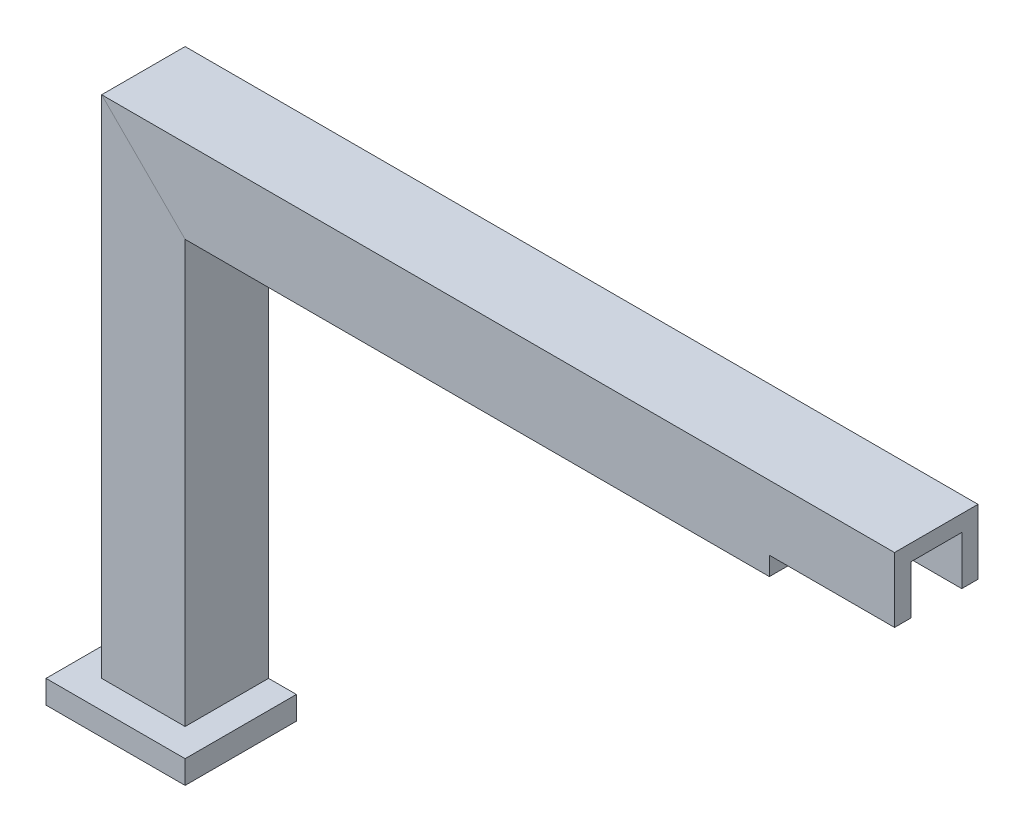
ISO-10303-21;
HEADER;
FILE_DESCRIPTION(('STEP AP214'),'2;1');
FILE_NAME('part.step','',(''),(''),'','','');
FILE_SCHEMA(('AUTOMOTIVE_DESIGN { 1 0 10303 214 1 1 1 1 }'));
ENDSEC;
DATA;
#1=APPLICATION_CONTEXT('core data for automotive mechanical design processes');
#2=APPLICATION_PROTOCOL_DEFINITION('international standard','automotive_design',2000,#1);
#3=PRODUCT_CONTEXT('',#1,'mechanical');
#4=PRODUCT('Part','Part','',(#3));
#5=PRODUCT_RELATED_PRODUCT_CATEGORY('part','',(#4));
#6=PRODUCT_DEFINITION_FORMATION('','',#4);
#7=PRODUCT_DEFINITION_CONTEXT('part definition',#1,'design');
#8=PRODUCT_DEFINITION('design','',#6,#7);
#9=PRODUCT_DEFINITION_SHAPE('','',#8);
#10=(LENGTH_UNIT() NAMED_UNIT(*) SI_UNIT(.MILLI.,.METRE.));
#11=(NAMED_UNIT(*) PLANE_ANGLE_UNIT() SI_UNIT($,.RADIAN.));
#12=(NAMED_UNIT(*) SI_UNIT($,.STERADIAN.) SOLID_ANGLE_UNIT());
#13=UNCERTAINTY_MEASURE_WITH_UNIT(LENGTH_MEASURE(1.E-05),#10,'distance_accuracy_value','');
#14=(GEOMETRIC_REPRESENTATION_CONTEXT(3) GLOBAL_UNCERTAINTY_ASSIGNED_CONTEXT((#13)) GLOBAL_UNIT_ASSIGNED_CONTEXT((#10,
#11,#12)) REPRESENTATION_CONTEXT('',''));
#15=CARTESIAN_POINT('',(0.,0.,0.));
#16=DIRECTION('',(0.,0.,1.));
#17=DIRECTION('',(1.,0.,0.));
#18=AXIS2_PLACEMENT_3D('',#15,#16,#17);
#19=CARTESIAN_POINT('',(-6.14999999999999,94.5,5.5));
#20=DIRECTION('',(0.,1.,0.));
#21=DIRECTION('',(0.,0.,1.));
#22=AXIS2_PLACEMENT_3D('',#19,#20,#21);
#23=PLANE('',#22);
#24=DIRECTION('',(0.,0.,1.));
#25=VECTOR('',#24,1.);
#26=CARTESIAN_POINT('',(135.,94.5,5.49999999999978));
#27=LINE('',#26,#25);
#28=CARTESIAN_POINT('',(135.,94.5,-5.5));
#29=VERTEX_POINT('',#28);
#30=CARTESIAN_POINT('',(135.,94.5,5.5));
#31=VERTEX_POINT('',#30);
#32=EDGE_CURVE('E422',#29,#31,#27,.T.);
#33=ORIENTED_EDGE('',*,*,#32,.F.);
#34=DIRECTION('',(1.,0.,0.));
#35=VECTOR('',#34,1.);
#36=CARTESIAN_POINT('',(-6.14999999999999,94.5,-5.5));
#37=LINE('',#36,#35);
#38=CARTESIAN_POINT('',(5.50000000000001,94.5,-5.5));
#39=VERTEX_POINT('',#38);
#40=EDGE_CURVE('E282',#39,#29,#37,.T.);
#41=ORIENTED_EDGE('',*,*,#40,.F.);
#42=DIRECTION('',(0.,0.,-1.));
#43=VECTOR('',#42,1.);
#44=CARTESIAN_POINT('',(5.5,94.5,5.5));
#45=LINE('',#44,#43);
#46=CARTESIAN_POINT('',(5.50000000000001,94.5,5.5));
#47=VERTEX_POINT('',#46);
#48=EDGE_CURVE('E224',#47,#39,#45,.T.);
#49=ORIENTED_EDGE('',*,*,#48,.F.);
#50=DIRECTION('',(1.,0.,0.));
#51=VECTOR('',#50,1.);
#52=CARTESIAN_POINT('',(-6.14999999999999,94.5,5.5));
#53=LINE('',#52,#51);
#54=EDGE_CURVE('E277',#47,#31,#53,.T.);
#55=ORIENTED_EDGE('',*,*,#54,.T.);
#56=EDGE_LOOP('',(#33,#41,#49,#55));
#57=FACE_BOUND('',#56,.T.);
#58=ADVANCED_FACE('F38',(#57),#23,.T.);
#59=CARTESIAN_POINT('',(0.,0.,0.));
#60=DIRECTION('',(0.,1.,0.));
#61=DIRECTION('',(0.,0.,1.));
#62=AXIS2_PLACEMENT_3D('',#59,#60,#61);
#63=PLANE('',#62);
#64=DIRECTION('',(0.,0.,1.));
#65=VECTOR('',#64,1.);
#66=CARTESIAN_POINT('',(-5.5,0.,5.5));
#67=LINE('',#66,#65);
#68=CARTESIAN_POINT('',(-5.5,0.,5.5));
#69=VERTEX_POINT('',#68);
#70=CARTESIAN_POINT('',(-5.5,0.,-5.5));
#71=VERTEX_POINT('',#70);
#72=EDGE_CURVE('E252',#69,#71,#67,.F.);
#73=ORIENTED_EDGE('',*,*,#72,.F.);
#74=DIRECTION('',(1.,0.,0.));
#75=VECTOR('',#74,1.);
#76=CARTESIAN_POINT('',(5.5,0.,5.5));
#77=LINE('',#76,#75);
#78=CARTESIAN_POINT('',(5.5,0.,5.5));
#79=VERTEX_POINT('',#78);
#80=EDGE_CURVE('E256',#79,#69,#77,.F.);
#81=ORIENTED_EDGE('',*,*,#80,.F.);
#82=DIRECTION('',(0.,0.,-1.));
#83=VECTOR('',#82,1.);
#84=CARTESIAN_POINT('',(5.5,0.,5.5));
#85=LINE('',#84,#83);
#86=CARTESIAN_POINT('',(5.5,0.,-5.5));
#87=VERTEX_POINT('',#86);
#88=EDGE_CURVE('E241',#87,#79,#85,.F.);
#89=ORIENTED_EDGE('',*,*,#88,.F.);
#90=DIRECTION('',(-1.,0.,0.));
#91=VECTOR('',#90,1.);
#92=CARTESIAN_POINT('',(5.5,0.,-5.5));
#93=LINE('',#92,#91);
#94=EDGE_CURVE('E237',#71,#87,#93,.F.);
#95=ORIENTED_EDGE('',*,*,#94,.F.);
#96=EDGE_LOOP('',(#73,#81,#89,#95));
#97=FACE_BOUND('',#96,.T.);
#98=ADVANCED_FACE('F454',(#97),#63,.T.);
#99=CARTESIAN_POINT('',(-5.5,0.,5.5));
#100=DIRECTION('',(1.,0.,0.));
#101=DIRECTION('',(0.,0.,-1.));
#102=AXIS2_PLACEMENT_3D('',#99,#100,#101);
#103=PLANE('',#102);
#104=DIRECTION('',(0.,1.,0.));
#105=VECTOR('',#104,1.);
#106=CARTESIAN_POINT('',(-5.5,0.,-5.5));
#107=LINE('',#106,#105);
#108=CARTESIAN_POINT('',(-5.49999999999999,105.5,-5.5));
#109=VERTEX_POINT('',#108);
#110=EDGE_CURVE('E248',#71,#109,#107,.T.);
#111=ORIENTED_EDGE('',*,*,#110,.T.);
#112=DIRECTION('',(0.,0.,1.));
#113=VECTOR('',#112,1.);
#114=CARTESIAN_POINT('',(-5.5,105.5,5.5));
#115=LINE('',#114,#113);
#116=CARTESIAN_POINT('',(-5.49999999999999,105.5,5.5));
#117=VERTEX_POINT('',#116);
#118=EDGE_CURVE('E232',#109,#117,#115,.T.);
#119=ORIENTED_EDGE('',*,*,#118,.T.);
#120=DIRECTION('',(0.,1.,0.));
#121=VECTOR('',#120,1.);
#122=CARTESIAN_POINT('',(-5.5,0.,5.5));
#123=LINE('',#122,#121);
#124=EDGE_CURVE('E260',#69,#117,#123,.T.);
#125=ORIENTED_EDGE('',*,*,#124,.F.);
#126=ORIENTED_EDGE('',*,*,#72,.T.);
#127=EDGE_LOOP('',(#111,#119,#125,#126));
#128=FACE_BOUND('',#127,.T.);
#129=ADVANCED_FACE('F465',(#128),#103,.T.);
#130=CARTESIAN_POINT('',(5.5,0.,-5.5));
#131=DIRECTION('',(0.,0.,1.));
#132=DIRECTION('',(1.,0.,0.));
#133=AXIS2_PLACEMENT_3D('',#130,#131,#132);
#134=PLANE('',#133);
#135=DIRECTION('',(0.,1.,0.));
#136=VECTOR('',#135,1.);
#137=CARTESIAN_POINT('',(5.5,0.,-5.5));
#138=LINE('',#137,#136);
#139=EDGE_CURVE('E243',#87,#39,#138,.T.);
#140=ORIENTED_EDGE('',*,*,#139,.T.);
#141=DIRECTION('',(-0.707106781186548,0.707106781186548,0.));
#142=VECTOR('',#141,1.);
#143=CARTESIAN_POINT('',(52.75,47.25,-5.5));
#144=LINE('',#143,#142);
#145=EDGE_CURVE('E236',#39,#109,#144,.T.);
#146=ORIENTED_EDGE('',*,*,#145,.T.);
#147=ORIENTED_EDGE('',*,*,#110,.F.);
#148=ORIENTED_EDGE('',*,*,#94,.T.);
#149=EDGE_LOOP('',(#140,#146,#147,#148));
#150=FACE_BOUND('',#149,.T.);
#151=ADVANCED_FACE('F651',(#150),#134,.T.);
#152=CARTESIAN_POINT('',(5.5,0.,5.5));
#153=DIRECTION('',(-1.,0.,0.));
#154=DIRECTION('',(0.,0.,1.));
#155=AXIS2_PLACEMENT_3D('',#152,#153,#154);
#156=PLANE('',#155);
#157=DIRECTION('',(0.,1.,0.));
#158=VECTOR('',#157,1.);
#159=CARTESIAN_POINT('',(5.5,0.,5.5));
#160=LINE('',#159,#158);
#161=EDGE_CURVE('E247',#79,#47,#160,.T.);
#162=ORIENTED_EDGE('',*,*,#161,.T.);
#163=ORIENTED_EDGE('',*,*,#48,.T.);
#164=ORIENTED_EDGE('',*,*,#139,.F.);
#165=ORIENTED_EDGE('',*,*,#88,.T.);
#166=EDGE_LOOP('',(#162,#163,#164,#165));
#167=FACE_BOUND('',#166,.T.);
#168=ADVANCED_FACE('F643',(#167),#156,.T.);
#169=CARTESIAN_POINT('',(5.5,0.,5.5));
#170=DIRECTION('',(0.,0.,-1.));
#171=DIRECTION('',(-1.,0.,0.));
#172=AXIS2_PLACEMENT_3D('',#169,#170,#171);
#173=PLANE('',#172);
#174=ORIENTED_EDGE('',*,*,#124,.T.);
#175=DIRECTION('',(0.707106781186548,-0.707106781186548,0.));
#176=VECTOR('',#175,1.);
#177=CARTESIAN_POINT('',(52.75,47.25,5.5));
#178=LINE('',#177,#176);
#179=EDGE_CURVE('E228',#117,#47,#178,.T.);
#180=ORIENTED_EDGE('',*,*,#179,.T.);
#181=ORIENTED_EDGE('',*,*,#161,.F.);
#182=ORIENTED_EDGE('',*,*,#80,.T.);
#183=EDGE_LOOP('',(#174,#180,#181,#182));
#184=FACE_BOUND('',#183,.T.);
#185=ADVANCED_FACE('F479',(#184),#173,.T.);
#186=CARTESIAN_POINT('',(-6.14999999999999,105.5,5.5));
#187=DIRECTION('',(0.,-1.,0.));
#188=DIRECTION('',(0.,0.,-1.));
#189=AXIS2_PLACEMENT_3D('',#186,#187,#188);
#190=PLANE('',#189);
#191=DIRECTION('',(0.,0.,-1.));
#192=VECTOR('',#191,1.);
#193=CARTESIAN_POINT('',(161.990817936662,105.5,5.5));
#194=LINE('',#193,#192);
#195=CARTESIAN_POINT('',(161.990817936662,105.5,5.5));
#196=VERTEX_POINT('',#195);
#197=CARTESIAN_POINT('',(161.990817936662,105.5,-5.5));
#198=VERTEX_POINT('',#197);
#199=EDGE_CURVE('E397',#196,#198,#194,.T.);
#200=ORIENTED_EDGE('',*,*,#199,.F.);
#201=DIRECTION('',(1.,0.,0.));
#202=VECTOR('',#201,1.);
#203=CARTESIAN_POINT('',(-6.14999999999999,105.5,5.5));
#204=LINE('',#203,#202);
#205=EDGE_CURVE('E273',#117,#196,#204,.T.);
#206=ORIENTED_EDGE('',*,*,#205,.F.);
#207=ORIENTED_EDGE('',*,*,#118,.F.);
#208=DIRECTION('',(1.,0.,0.));
#209=VECTOR('',#208,1.);
#210=CARTESIAN_POINT('',(-6.14999999999999,105.5,-5.5));
#211=LINE('',#210,#209);
#212=EDGE_CURVE('E242',#109,#198,#211,.T.);
#213=ORIENTED_EDGE('',*,*,#212,.T.);
#214=EDGE_LOOP('',(#200,#206,#207,#213));
#215=FACE_BOUND('',#214,.T.);
#216=ADVANCED_FACE('F476',(#215),#190,.T.);
#217=CARTESIAN_POINT('',(-6.14999999999999,94.5,-5.5));
#218=DIRECTION('',(0.,0.,1.));
#219=DIRECTION('',(0.,-1.,0.));
#220=AXIS2_PLACEMENT_3D('',#217,#218,#219);
#221=PLANE('',#220);
#222=DIRECTION('',(0.,-1.,0.));
#223=VECTOR('',#222,1.);
#224=CARTESIAN_POINT('',(161.990817936662,94.5,-5.5));
#225=LINE('',#224,#223);
#226=CARTESIAN_POINT('',(161.990817936662,95.,-5.5));
#227=VERTEX_POINT('',#226);
#228=EDGE_CURVE('E394',#198,#227,#225,.T.);
#229=ORIENTED_EDGE('',*,*,#228,.F.);
#230=ORIENTED_EDGE('',*,*,#212,.F.);
#231=ORIENTED_EDGE('',*,*,#145,.F.);
#232=ORIENTED_EDGE('',*,*,#40,.T.);
#233=DIRECTION('',(0.,-1.,0.));
#234=VECTOR('',#233,1.);
#235=CARTESIAN_POINT('',(135.,94.5,-5.5));
#236=LINE('',#235,#234);
#237=CARTESIAN_POINT('',(135.,95.,-5.5));
#238=VERTEX_POINT('',#237);
#239=EDGE_CURVE('E213',#238,#29,#236,.T.);
#240=ORIENTED_EDGE('',*,*,#239,.F.);
#241=DIRECTION('',(1.,0.,0.));
#242=VECTOR('',#241,1.);
#243=CARTESIAN_POINT('',(-6.14999999999999,95.,-5.5));
#244=LINE('',#243,#242);
#245=EDGE_CURVE('E416',#238,#227,#244,.T.);
#246=ORIENTED_EDGE('',*,*,#245,.T.);
#247=EDGE_LOOP('',(#229,#230,#231,#232,#240,#246));
#248=FACE_BOUND('',#247,.T.);
#249=ADVANCED_FACE('F470',(#248),#221,.T.);
#250=CARTESIAN_POINT('',(-6.14999999999999,94.5,5.5));
#251=DIRECTION('',(0.,0.,-1.));
#252=DIRECTION('',(0.,1.,0.));
#253=AXIS2_PLACEMENT_3D('',#250,#251,#252);
#254=PLANE('',#253);
#255=DIRECTION('',(0.,1.,0.));
#256=VECTOR('',#255,1.);
#257=CARTESIAN_POINT('',(161.990817936662,94.5,5.5));
#258=LINE('',#257,#256);
#259=CARTESIAN_POINT('',(161.990817936662,95.,5.5));
#260=VERTEX_POINT('',#259);
#261=EDGE_CURVE('E391',#260,#196,#258,.T.);
#262=ORIENTED_EDGE('',*,*,#261,.F.);
#263=DIRECTION('',(-1.,0.,0.));
#264=VECTOR('',#263,1.);
#265=CARTESIAN_POINT('',(-6.14999999999999,95.,5.5));
#266=LINE('',#265,#264);
#267=CARTESIAN_POINT('',(135.,95.,5.5));
#268=VERTEX_POINT('',#267);
#269=EDGE_CURVE('E62',#260,#268,#266,.T.);
#270=ORIENTED_EDGE('',*,*,#269,.T.);
#271=DIRECTION('',(0.,1.,0.));
#272=VECTOR('',#271,1.);
#273=CARTESIAN_POINT('',(135.,94.5,5.5));
#274=LINE('',#273,#272);
#275=EDGE_CURVE('E346',#31,#268,#274,.T.);
#276=ORIENTED_EDGE('',*,*,#275,.F.);
#277=ORIENTED_EDGE('',*,*,#54,.F.);
#278=ORIENTED_EDGE('',*,*,#179,.F.);
#279=ORIENTED_EDGE('',*,*,#205,.T.);
#280=EDGE_LOOP('',(#262,#270,#276,#277,#278,#279));
#281=FACE_BOUND('',#280,.T.);
#282=ADVANCED_FACE('F472',(#281),#254,.T.);
#283=CARTESIAN_POINT('',(0.,95.,0.));
#284=DIRECTION('',(0.,-1.,0.));
#285=DIRECTION('',(0.,0.,-1.));
#286=AXIS2_PLACEMENT_3D('',#283,#284,#285);
#287=PLANE('',#286);
#288=DIRECTION('',(0.,0.,-1.));
#289=VECTOR('',#288,1.);
#290=CARTESIAN_POINT('',(161.990817936662,95.,0.));
#291=LINE('',#290,#289);
#292=CARTESIAN_POINT('',(161.990817936662,95.,-9.00000000000001));
#293=VERTEX_POINT('',#292);
#294=EDGE_CURVE('E54',#227,#293,#291,.T.);
#295=ORIENTED_EDGE('',*,*,#294,.F.);
#296=ORIENTED_EDGE('',*,*,#245,.F.);
#297=DIRECTION('',(0.,0.,-1.));
#298=VECTOR('',#297,1.);
#299=CARTESIAN_POINT('',(135.,95.,-9.00000000000001));
#300=LINE('',#299,#298);
#301=CARTESIAN_POINT('',(135.,95.,-9.00000000000001));
#302=VERTEX_POINT('',#301);
#303=EDGE_CURVE('E405',#238,#302,#300,.T.);
#304=ORIENTED_EDGE('',*,*,#303,.T.);
#305=DIRECTION('',(1.,0.,0.));
#306=VECTOR('',#305,1.);
#307=CARTESIAN_POINT('',(185.,95.,-9.00000000000001));
#308=LINE('',#307,#306);
#309=EDGE_CURVE('E404',#302,#293,#308,.T.);
#310=ORIENTED_EDGE('',*,*,#309,.T.);
#311=EDGE_LOOP('',(#295,#296,#304,#310));
#312=FACE_BOUND('',#311,.T.);
#313=ADVANCED_FACE('F475',(#312),#287,.T.);
#314=CARTESIAN_POINT('',(135.,95.,-9.00000000000001));
#315=DIRECTION('',(-1.,0.,0.));
#316=DIRECTION('',(0.,0.,1.));
#317=AXIS2_PLACEMENT_3D('',#314,#315,#316);
#318=PLANE('',#317);
#319=ORIENTED_EDGE('',*,*,#239,.T.);
#320=ORIENTED_EDGE('',*,*,#32,.T.);
#321=ORIENTED_EDGE('',*,*,#275,.T.);
#322=CARTESIAN_POINT('',(135.,95.,9.));
#323=VERTEX_POINT('',#322);
#324=EDGE_CURVE('E401',#323,#268,#300,.T.);
#325=ORIENTED_EDGE('',*,*,#324,.F.);
#326=DIRECTION('',(0.,-1.,0.));
#327=VECTOR('',#326,1.);
#328=CARTESIAN_POINT('',(135.,95.,9.));
#329=LINE('',#328,#327);
#330=CARTESIAN_POINT('',(135.,91.,9.));
#331=VERTEX_POINT('',#330);
#332=EDGE_CURVE('E413',#323,#331,#329,.T.);
#333=ORIENTED_EDGE('',*,*,#332,.T.);
#334=DIRECTION('',(0.,0.,-1.));
#335=VECTOR('',#334,1.);
#336=CARTESIAN_POINT('',(135.,91.,-9.00000000000001));
#337=LINE('',#336,#335);
#338=CARTESIAN_POINT('',(135.,91.,-9.00000000000001));
#339=VERTEX_POINT('',#338);
#340=EDGE_CURVE('E400',#331,#339,#337,.T.);
#341=ORIENTED_EDGE('',*,*,#340,.T.);
#342=DIRECTION('',(0.,-1.,0.));
#343=VECTOR('',#342,1.);
#344=CARTESIAN_POINT('',(135.,95.,-9.00000000000001));
#345=LINE('',#344,#343);
#346=EDGE_CURVE('E410',#302,#339,#345,.T.);
#347=ORIENTED_EDGE('',*,*,#346,.F.);
#348=ORIENTED_EDGE('',*,*,#303,.F.);
#349=EDGE_LOOP('',(#319,#320,#321,#325,#333,#341,#347,#348));
#350=FACE_BOUND('',#349,.T.);
#351=ADVANCED_FACE('F507',(#350),#318,.F.);
#352=DIRECTION('',(0.,0.,-1.));
#353=VECTOR('',#352,1.);
#354=CARTESIAN_POINT('',(161.990817936662,95.,0.));
#355=LINE('',#354,#353);
#356=CARTESIAN_POINT('',(161.990817936662,95.,9.));
#357=VERTEX_POINT('',#356);
#358=EDGE_CURVE('E383',#357,#260,#355,.T.);
#359=ORIENTED_EDGE('',*,*,#358,.F.);
#360=DIRECTION('',(-1.,0.,0.));
#361=VECTOR('',#360,1.);
#362=CARTESIAN_POINT('',(185.,95.,9.));
#363=LINE('',#362,#361);
#364=EDGE_CURVE('E380',#357,#323,#363,.T.);
#365=ORIENTED_EDGE('',*,*,#364,.T.);
#366=ORIENTED_EDGE('',*,*,#324,.T.);
#367=ORIENTED_EDGE('',*,*,#269,.F.);
#368=EDGE_LOOP('',(#359,#365,#366,#367));
#369=FACE_BOUND('',#368,.T.);
#370=ADVANCED_FACE('F492',(#369),#287,.T.);
#371=CARTESIAN_POINT('',(-9.99999999999998,91.,9.));
#372=DIRECTION('',(0.,-1.,0.));
#373=DIRECTION('',(0.,0.,-1.));
#374=AXIS2_PLACEMENT_3D('',#371,#372,#373);
#375=PLANE('',#374);
#376=ORIENTED_EDGE('',*,*,#340,.F.);
#377=DIRECTION('',(1.,0.,0.));
#378=VECTOR('',#377,1.);
#379=CARTESIAN_POINT('',(-9.99999999999998,91.,9.));
#380=LINE('',#379,#378);
#381=CARTESIAN_POINT('',(9.00000000000001,91.,9.));
#382=VERTEX_POINT('',#381);
#383=EDGE_CURVE('E320',#382,#331,#380,.T.);
#384=ORIENTED_EDGE('',*,*,#383,.F.);
#385=DIRECTION('',(0.,0.,1.));
#386=VECTOR('',#385,1.);
#387=CARTESIAN_POINT('',(9.,91.,9.));
#388=LINE('',#387,#386);
#389=CARTESIAN_POINT('',(9.00000000000001,91.,-9.));
#390=VERTEX_POINT('',#389);
#391=EDGE_CURVE('E310',#390,#382,#388,.T.);
#392=ORIENTED_EDGE('',*,*,#391,.F.);
#393=DIRECTION('',(1.,0.,0.));
#394=VECTOR('',#393,1.);
#395=CARTESIAN_POINT('',(-9.99999999999998,91.,-9.));
#396=LINE('',#395,#394);
#397=EDGE_CURVE('E337',#390,#339,#396,.T.);
#398=ORIENTED_EDGE('',*,*,#397,.T.);
#399=EDGE_LOOP('',(#376,#384,#392,#398));
#400=FACE_BOUND('',#399,.T.);
#401=ADVANCED_FACE('F483',(#400),#375,.T.);
#402=CARTESIAN_POINT('',(-9.99999999999998,91.,9.));
#403=DIRECTION('',(0.,0.,1.));
#404=DIRECTION('',(0.,-1.,0.));
#405=AXIS2_PLACEMENT_3D('',#402,#403,#404);
#406=PLANE('',#405);
#407=DIRECTION('',(0.,-1.,0.));
#408=VECTOR('',#407,1.);
#409=CARTESIAN_POINT('',(161.990817936662,91.,9.));
#410=LINE('',#409,#408);
#411=CARTESIAN_POINT('',(161.990817936662,109.,9.00000000000001));
#412=VERTEX_POINT('',#411);
#413=EDGE_CURVE('E362',#412,#357,#410,.T.);
#414=ORIENTED_EDGE('',*,*,#413,.F.);
#415=DIRECTION('',(1.,0.,0.));
#416=VECTOR('',#415,1.);
#417=CARTESIAN_POINT('',(-9.99999999999998,109.,9.00000000000001));
#418=LINE('',#417,#416);
#419=CARTESIAN_POINT('',(-8.99999999999999,109.,9.00000000000001));
#420=VERTEX_POINT('',#419);
#421=EDGE_CURVE('E220',#420,#412,#418,.T.);
#422=ORIENTED_EDGE('',*,*,#421,.F.);
#423=DIRECTION('',(-0.707106781186548,0.707106781186548,0.));
#424=VECTOR('',#423,1.);
#425=CARTESIAN_POINT('',(54.5,45.5,9.));
#426=LINE('',#425,#424);
#427=EDGE_CURVE('E306',#382,#420,#426,.T.);
#428=ORIENTED_EDGE('',*,*,#427,.F.);
#429=ORIENTED_EDGE('',*,*,#383,.T.);
#430=ORIENTED_EDGE('',*,*,#332,.F.);
#431=ORIENTED_EDGE('',*,*,#364,.F.);
#432=EDGE_LOOP('',(#414,#422,#428,#429,#430,#431));
#433=FACE_BOUND('',#432,.T.);
#434=ADVANCED_FACE('F40',(#433),#406,.T.);
#435=CARTESIAN_POINT('',(-9.99999999999998,109.,9.00000000000001));
#436=DIRECTION('',(0.,1.,0.));
#437=DIRECTION('',(0.,0.,1.));
#438=AXIS2_PLACEMENT_3D('',#435,#436,#437);
#439=PLANE('',#438);
#440=DIRECTION('',(0.,0.,1.));
#441=VECTOR('',#440,1.);
#442=CARTESIAN_POINT('',(161.990817936662,109.,9.00000000000001));
#443=LINE('',#442,#441);
#444=CARTESIAN_POINT('',(161.990817936662,109.,-8.99999999999999));
#445=VERTEX_POINT('',#444);
#446=EDGE_CURVE('E352',#445,#412,#443,.T.);
#447=ORIENTED_EDGE('',*,*,#446,.F.);
#448=DIRECTION('',(1.,0.,0.));
#449=VECTOR('',#448,1.);
#450=CARTESIAN_POINT('',(-9.99999999999998,109.,-8.99999999999999));
#451=LINE('',#450,#449);
#452=CARTESIAN_POINT('',(-8.99999999999999,109.,-8.99999999999999));
#453=VERTEX_POINT('',#452);
#454=EDGE_CURVE('E333',#453,#445,#451,.T.);
#455=ORIENTED_EDGE('',*,*,#454,.F.);
#456=DIRECTION('',(0.,0.,-1.));
#457=VECTOR('',#456,1.);
#458=CARTESIAN_POINT('',(-9.,109.,9.00000000000001));
#459=LINE('',#458,#457);
#460=EDGE_CURVE('E302',#420,#453,#459,.T.);
#461=ORIENTED_EDGE('',*,*,#460,.F.);
#462=ORIENTED_EDGE('',*,*,#421,.T.);
#463=EDGE_LOOP('',(#447,#455,#461,#462));
#464=FACE_BOUND('',#463,.T.);
#465=ADVANCED_FACE('F359',(#464),#439,.T.);
#466=CARTESIAN_POINT('',(-9.99999999999998,91.,-9.));
#467=DIRECTION('',(0.,0.,-1.));
#468=DIRECTION('',(0.,1.,0.));
#469=AXIS2_PLACEMENT_3D('',#466,#467,#468);
#470=PLANE('',#469);
#471=DIRECTION('',(0.,1.,0.));
#472=VECTOR('',#471,1.);
#473=CARTESIAN_POINT('',(161.990817936662,91.,-9.));
#474=LINE('',#473,#472);
#475=EDGE_CURVE('E47',#293,#445,#474,.T.);
#476=ORIENTED_EDGE('',*,*,#475,.F.);
#477=ORIENTED_EDGE('',*,*,#309,.F.);
#478=ORIENTED_EDGE('',*,*,#346,.T.);
#479=ORIENTED_EDGE('',*,*,#397,.F.);
#480=DIRECTION('',(0.707106781186548,-0.707106781186548,0.));
#481=VECTOR('',#480,1.);
#482=CARTESIAN_POINT('',(54.5,45.5,-9.));
#483=LINE('',#482,#481);
#484=EDGE_CURVE('E298',#453,#390,#483,.T.);
#485=ORIENTED_EDGE('',*,*,#484,.F.);
#486=ORIENTED_EDGE('',*,*,#454,.T.);
#487=EDGE_LOOP('',(#476,#477,#478,#479,#485,#486));
#488=FACE_BOUND('',#487,.T.);
#489=ADVANCED_FACE('F364',(#488),#470,.T.);
#490=CARTESIAN_POINT('',(9.,0.,9.));
#491=DIRECTION('',(0.,0.,1.));
#492=DIRECTION('',(1.,0.,0.));
#493=AXIS2_PLACEMENT_3D('',#490,#491,#492);
#494=PLANE('',#493);
#495=DIRECTION('',(0.,1.,0.));
#496=VECTOR('',#495,1.);
#497=CARTESIAN_POINT('',(9.,0.,9.));
#498=LINE('',#497,#496);
#499=CARTESIAN_POINT('',(9.,0.,9.));
#500=VERTEX_POINT('',#499);
#501=EDGE_CURVE('E316',#500,#382,#498,.T.);
#502=ORIENTED_EDGE('',*,*,#501,.T.);
#503=ORIENTED_EDGE('',*,*,#427,.T.);
#504=DIRECTION('',(0.,1.,0.));
#505=VECTOR('',#504,1.);
#506=CARTESIAN_POINT('',(-9.,0.,9.00000000000001));
#507=LINE('',#506,#505);
#508=CARTESIAN_POINT('',(-9.,0.,9.00000000000001));
#509=VERTEX_POINT('',#508);
#510=EDGE_CURVE('E323',#509,#420,#507,.T.);
#511=ORIENTED_EDGE('',*,*,#510,.F.);
#512=DIRECTION('',(1.,0.,0.));
#513=VECTOR('',#512,1.);
#514=CARTESIAN_POINT('',(9.,0.,9.));
#515=LINE('',#514,#513);
#516=EDGE_CURVE('E278',#509,#500,#515,.T.);
#517=ORIENTED_EDGE('',*,*,#516,.T.);
#518=EDGE_LOOP('',(#502,#503,#511,#517));
#519=FACE_BOUND('',#518,.T.);
#520=ADVANCED_FACE('F373',(#519),#494,.T.);
#521=CARTESIAN_POINT('',(-9.,0.,9.00000000000001));
#522=DIRECTION('',(-1.,0.,0.));
#523=DIRECTION('',(0.,0.,1.));
#524=AXIS2_PLACEMENT_3D('',#521,#522,#523);
#525=PLANE('',#524);
#526=ORIENTED_EDGE('',*,*,#510,.T.);
#527=ORIENTED_EDGE('',*,*,#460,.T.);
#528=DIRECTION('',(0.,1.,0.));
#529=VECTOR('',#528,1.);
#530=CARTESIAN_POINT('',(-9.,0.,-8.99999999999999));
#531=LINE('',#530,#529);
#532=CARTESIAN_POINT('',(-9.,0.,-9.));
#533=VERTEX_POINT('',#532);
#534=EDGE_CURVE('E315',#533,#453,#531,.T.);
#535=ORIENTED_EDGE('',*,*,#534,.F.);
#536=DIRECTION('',(0.,0.,1.));
#537=VECTOR('',#536,1.);
#538=CARTESIAN_POINT('',(-9.,0.,9.00000000000001));
#539=LINE('',#538,#537);
#540=EDGE_CURVE('E196',#533,#509,#539,.T.);
#541=ORIENTED_EDGE('',*,*,#540,.T.);
#542=EDGE_LOOP('',(#526,#527,#535,#541));
#543=FACE_BOUND('',#542,.T.);
#544=ADVANCED_FACE('F375',(#543),#525,.T.);
#545=CARTESIAN_POINT('',(9.,0.,-9.));
#546=DIRECTION('',(0.,0.,-1.));
#547=DIRECTION('',(-1.,0.,0.));
#548=AXIS2_PLACEMENT_3D('',#545,#546,#547);
#549=PLANE('',#548);
#550=ORIENTED_EDGE('',*,*,#534,.T.);
#551=ORIENTED_EDGE('',*,*,#484,.T.);
#552=DIRECTION('',(0.,1.,0.));
#553=VECTOR('',#552,1.);
#554=CARTESIAN_POINT('',(9.,0.,-9.));
#555=LINE('',#554,#553);
#556=CARTESIAN_POINT('',(9.,0.,-9.));
#557=VERTEX_POINT('',#556);
#558=EDGE_CURVE('E311',#557,#390,#555,.T.);
#559=ORIENTED_EDGE('',*,*,#558,.F.);
#560=DIRECTION('',(1.,0.,0.));
#561=VECTOR('',#560,1.);
#562=CARTESIAN_POINT('',(0.,0.,-8.99999999999999));
#563=LINE('',#562,#561);
#564=CARTESIAN_POINT('',(15.,0.,-8.99999999999999));
#565=VERTEX_POINT('',#564);
#566=EDGE_CURVE('E11',#557,#565,#563,.T.);
#567=ORIENTED_EDGE('',*,*,#566,.T.);
#568=DIRECTION('',(0.,1.,0.));
#569=VECTOR('',#568,1.);
#570=CARTESIAN_POINT('',(15.,-10.,-8.99999999999999));
#571=LINE('',#570,#569);
#572=CARTESIAN_POINT('',(15.,-5.,-8.99999999999999));
#573=VERTEX_POINT('',#572);
#574=EDGE_CURVE('E188',#573,#565,#571,.T.);
#575=ORIENTED_EDGE('',*,*,#574,.F.);
#576=DIRECTION('',(1.,0.,0.));
#577=VECTOR('',#576,1.);
#578=CARTESIAN_POINT('',(0.,-5.,-8.99999999999999));
#579=LINE('',#578,#577);
#580=CARTESIAN_POINT('',(-15.,-5.,-9.));
#581=VERTEX_POINT('',#580);
#582=EDGE_CURVE('E183',#581,#573,#579,.T.);
#583=ORIENTED_EDGE('',*,*,#582,.F.);
#584=DIRECTION('',(0.,1.,0.));
#585=VECTOR('',#584,1.);
#586=CARTESIAN_POINT('',(-15.,-10.,-9.));
#587=LINE('',#586,#585);
#588=CARTESIAN_POINT('',(-15.,0.,-9.));
#589=VERTEX_POINT('',#588);
#590=EDGE_CURVE('E176',#581,#589,#587,.T.);
#591=ORIENTED_EDGE('',*,*,#590,.T.);
#592=DIRECTION('',(1.,0.,0.));
#593=VECTOR('',#592,1.);
#594=CARTESIAN_POINT('',(-15.,0.,-9.));
#595=LINE('',#594,#593);
#596=EDGE_CURVE('E180',#589,#533,#595,.T.);
#597=ORIENTED_EDGE('',*,*,#596,.T.);
#598=EDGE_LOOP('',(#550,#551,#559,#567,#575,#583,#591,#597));
#599=FACE_BOUND('',#598,.T.);
#600=ADVANCED_FACE('F179',(#599),#549,.T.);
#601=CARTESIAN_POINT('',(9.,0.,9.));
#602=DIRECTION('',(1.,0.,0.));
#603=DIRECTION('',(0.,0.,-1.));
#604=AXIS2_PLACEMENT_3D('',#601,#602,#603);
#605=PLANE('',#604);
#606=ORIENTED_EDGE('',*,*,#558,.T.);
#607=ORIENTED_EDGE('',*,*,#391,.T.);
#608=ORIENTED_EDGE('',*,*,#501,.F.);
#609=DIRECTION('',(0.,0.,-1.));
#610=VECTOR('',#609,1.);
#611=CARTESIAN_POINT('',(9.,0.,9.));
#612=LINE('',#611,#610);
#613=EDGE_CURVE('E289',#500,#557,#612,.T.);
#614=ORIENTED_EDGE('',*,*,#613,.T.);
#615=EDGE_LOOP('',(#606,#607,#608,#614));
#616=FACE_BOUND('',#615,.T.);
#617=ADVANCED_FACE('F369',(#616),#605,.T.);
#618=CARTESIAN_POINT('',(0.,-5.,0.));
#619=DIRECTION('',(0.,1.,0.));
#620=DIRECTION('',(0.,0.,1.));
#621=AXIS2_PLACEMENT_3D('',#618,#619,#620);
#622=PLANE('',#621);
#623=DIRECTION('',(0.,0.,1.));
#624=VECTOR('',#623,1.);
#625=CARTESIAN_POINT('',(-15.,-5.,-15.));
#626=LINE('',#625,#624);
#627=CARTESIAN_POINT('',(-15.,-5.,15.));
#628=VERTEX_POINT('',#627);
#629=EDGE_CURVE('E430',#581,#628,#626,.T.);
#630=ORIENTED_EDGE('',*,*,#629,.F.);
#631=ORIENTED_EDGE('',*,*,#582,.T.);
#632=DIRECTION('',(0.,0.,-1.));
#633=VECTOR('',#632,1.);
#634=CARTESIAN_POINT('',(15.,-5.,-15.));
#635=LINE('',#634,#633);
#636=CARTESIAN_POINT('',(15.,-5.,15.));
#637=VERTEX_POINT('',#636);
#638=EDGE_CURVE('E210',#637,#573,#635,.T.);
#639=ORIENTED_EDGE('',*,*,#638,.F.);
#640=DIRECTION('',(1.,0.,0.));
#641=VECTOR('',#640,1.);
#642=CARTESIAN_POINT('',(-15.,-5.,15.));
#643=LINE('',#642,#641);
#644=EDGE_CURVE('E223',#628,#637,#643,.T.);
#645=ORIENTED_EDGE('',*,*,#644,.F.);
#646=EDGE_LOOP('',(#630,#631,#639,#645));
#647=FACE_BOUND('',#646,.T.);
#648=ADVANCED_FACE('F440',(#647),#622,.F.);
#649=CARTESIAN_POINT('',(-15.,-5.,-15.));
#650=DIRECTION('',(-1.,0.,0.));
#651=DIRECTION('',(0.,0.,1.));
#652=AXIS2_PLACEMENT_3D('',#649,#650,#651);
#653=PLANE('',#652);
#654=ORIENTED_EDGE('',*,*,#590,.F.);
#655=ORIENTED_EDGE('',*,*,#629,.T.);
#656=DIRECTION('',(0.,1.,0.));
#657=VECTOR('',#656,1.);
#658=CARTESIAN_POINT('',(-15.,-5.,15.));
#659=LINE('',#658,#657);
#660=CARTESIAN_POINT('',(-15.,0.,15.));
#661=VERTEX_POINT('',#660);
#662=EDGE_CURVE('E202',#628,#661,#659,.T.);
#663=ORIENTED_EDGE('',*,*,#662,.T.);
#664=DIRECTION('',(0.,0.,1.));
#665=VECTOR('',#664,1.);
#666=CARTESIAN_POINT('',(-15.,0.,-15.));
#667=LINE('',#666,#665);
#668=EDGE_CURVE('E193',#589,#661,#667,.T.);
#669=ORIENTED_EDGE('',*,*,#668,.F.);
#670=EDGE_LOOP('',(#654,#655,#663,#669));
#671=FACE_BOUND('',#670,.T.);
#672=ADVANCED_FACE('F200',(#671),#653,.T.);
#673=CARTESIAN_POINT('',(-15.,-5.,15.));
#674=DIRECTION('',(0.,0.,1.));
#675=DIRECTION('',(1.,0.,0.));
#676=AXIS2_PLACEMENT_3D('',#673,#674,#675);
#677=PLANE('',#676);
#678=DIRECTION('',(1.,0.,0.));
#679=VECTOR('',#678,1.);
#680=CARTESIAN_POINT('',(-15.,0.,15.));
#681=LINE('',#680,#679);
#682=CARTESIAN_POINT('',(15.,0.,15.));
#683=VERTEX_POINT('',#682);
#684=EDGE_CURVE('E205',#661,#683,#681,.T.);
#685=ORIENTED_EDGE('',*,*,#684,.F.);
#686=ORIENTED_EDGE('',*,*,#662,.F.);
#687=ORIENTED_EDGE('',*,*,#644,.T.);
#688=DIRECTION('',(0.,1.,0.));
#689=VECTOR('',#688,1.);
#690=CARTESIAN_POINT('',(15.,-5.,15.));
#691=LINE('',#690,#689);
#692=EDGE_CURVE('E217',#637,#683,#691,.T.);
#693=ORIENTED_EDGE('',*,*,#692,.T.);
#694=EDGE_LOOP('',(#685,#686,#687,#693));
#695=FACE_BOUND('',#694,.T.);
#696=ADVANCED_FACE('F436',(#695),#677,.T.);
#697=CARTESIAN_POINT('',(15.,-5.,-15.));
#698=DIRECTION('',(1.,0.,0.));
#699=DIRECTION('',(0.,0.,-1.));
#700=AXIS2_PLACEMENT_3D('',#697,#698,#699);
#701=PLANE('',#700);
#702=ORIENTED_EDGE('',*,*,#574,.T.);
#703=DIRECTION('',(0.,0.,-1.));
#704=VECTOR('',#703,1.);
#705=CARTESIAN_POINT('',(15.,0.,-15.));
#706=LINE('',#705,#704);
#707=EDGE_CURVE('E206',#683,#565,#706,.T.);
#708=ORIENTED_EDGE('',*,*,#707,.F.);
#709=ORIENTED_EDGE('',*,*,#692,.F.);
#710=ORIENTED_EDGE('',*,*,#638,.T.);
#711=EDGE_LOOP('',(#702,#708,#709,#710));
#712=FACE_BOUND('',#711,.T.);
#713=ADVANCED_FACE('F443',(#712),#701,.T.);
#714=ORIENTED_EDGE('',*,*,#596,.F.);
#715=ORIENTED_EDGE('',*,*,#668,.T.);
#716=ORIENTED_EDGE('',*,*,#684,.T.);
#717=ORIENTED_EDGE('',*,*,#707,.T.);
#718=ORIENTED_EDGE('',*,*,#566,.F.);
#719=ORIENTED_EDGE('',*,*,#613,.F.);
#720=ORIENTED_EDGE('',*,*,#516,.F.);
#721=ORIENTED_EDGE('',*,*,#540,.F.);
#722=EDGE_LOOP('',(#714,#715,#716,#717,#718,#719,#720,#721));
#723=FACE_BOUND('',#722,.T.);
#724=ADVANCED_FACE('F191',(#723),#63,.T.);
#725=CARTESIAN_POINT('',(161.990817936662,0.,0.));
#726=DIRECTION('',(-1.,0.,0.));
#727=DIRECTION('',(0.,0.,1.));
#728=AXIS2_PLACEMENT_3D('',#725,#726,#727);
#729=PLANE('',#728);
#730=ORIENTED_EDGE('',*,*,#199,.T.);
#731=ORIENTED_EDGE('',*,*,#228,.T.);
#732=ORIENTED_EDGE('',*,*,#294,.T.);
#733=ORIENTED_EDGE('',*,*,#475,.T.);
#734=ORIENTED_EDGE('',*,*,#446,.T.);
#735=ORIENTED_EDGE('',*,*,#413,.T.);
#736=ORIENTED_EDGE('',*,*,#358,.T.);
#737=ORIENTED_EDGE('',*,*,#261,.T.);
#738=EDGE_LOOP('',(#730,#731,#732,#733,#734,#735,#736,#737));
#739=FACE_BOUND('',#738,.T.);
#740=ADVANCED_FACE('F351',(#739),#729,.F.);
#741=CLOSED_SHELL('',(#58,#98,#129,#151,#168,#185,#216,#249,#282,#313,#351,#370,#401,#434,#465,
#489,#520,#544,#600,#617,#648,#672,#696,#713,#724,#740));
#742=MANIFOLD_SOLID_BREP('B2',#741);
#743=ADVANCED_BREP_SHAPE_REPRESENTATION('',(#18,#742),#14);
#744=SHAPE_DEFINITION_REPRESENTATION(#9,#743);
ENDSEC;
END-ISO-10303-21;
